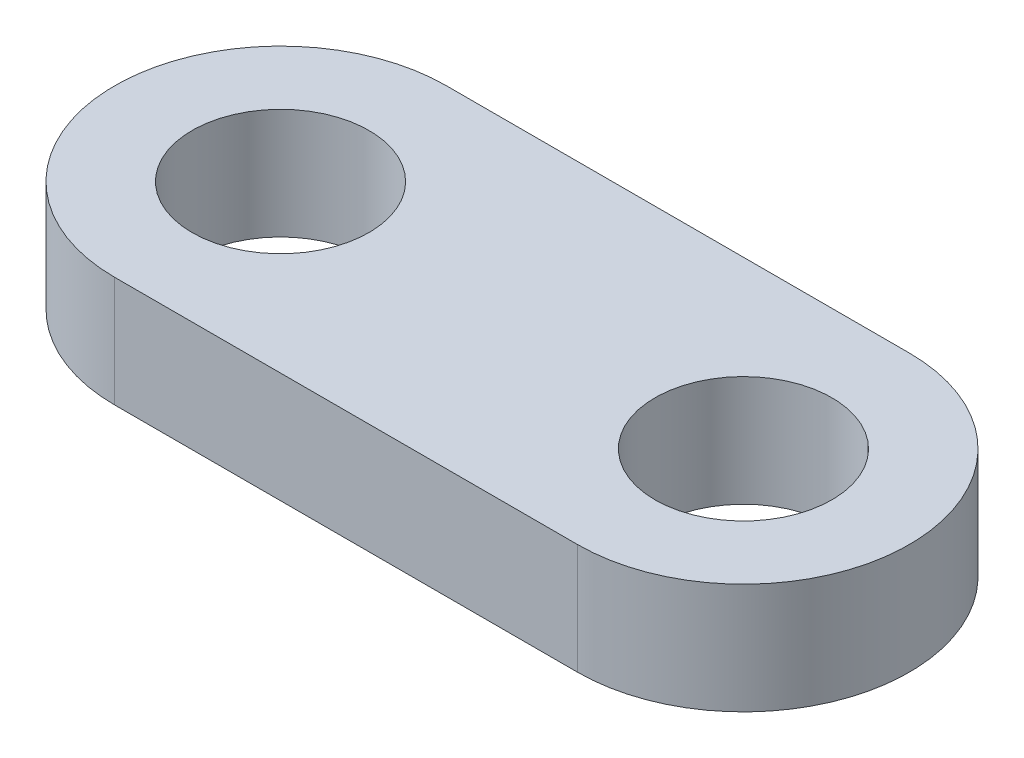
ISO-10303-21;
HEADER;
FILE_DESCRIPTION(('STEP AP214'),'2;1');
FILE_NAME('part.step','',(''),(''),'','','');
FILE_SCHEMA(('AUTOMOTIVE_DESIGN { 1 0 10303 214 1 1 1 1 }'));
ENDSEC;
DATA;
#1=APPLICATION_CONTEXT('core data for automotive mechanical design processes');
#2=APPLICATION_PROTOCOL_DEFINITION('international standard','automotive_design',2000,#1);
#3=PRODUCT_CONTEXT('',#1,'mechanical');
#4=PRODUCT('Part','Part','',(#3));
#5=PRODUCT_RELATED_PRODUCT_CATEGORY('part','',(#4));
#6=PRODUCT_DEFINITION_FORMATION('','',#4);
#7=PRODUCT_DEFINITION_CONTEXT('part definition',#1,'design');
#8=PRODUCT_DEFINITION('design','',#6,#7);
#9=PRODUCT_DEFINITION_SHAPE('','',#8);
#10=(LENGTH_UNIT() NAMED_UNIT(*) SI_UNIT(.MILLI.,.METRE.));
#11=(NAMED_UNIT(*) PLANE_ANGLE_UNIT() SI_UNIT($,.RADIAN.));
#12=(NAMED_UNIT(*) SI_UNIT($,.STERADIAN.) SOLID_ANGLE_UNIT());
#13=UNCERTAINTY_MEASURE_WITH_UNIT(LENGTH_MEASURE(1.E-05),#10,'distance_accuracy_value','');
#14=(GEOMETRIC_REPRESENTATION_CONTEXT(3) GLOBAL_UNCERTAINTY_ASSIGNED_CONTEXT((#13)) GLOBAL_UNIT_ASSIGNED_CONTEXT((#10,
#11,#12)) REPRESENTATION_CONTEXT('',''));
#15=CARTESIAN_POINT('',(0.,0.,0.));
#16=DIRECTION('',(0.,0.,1.));
#17=DIRECTION('',(1.,0.,0.));
#18=AXIS2_PLACEMENT_3D('',#15,#16,#17);
#19=CARTESIAN_POINT('',(3.1395,4.25,0.));
#20=DIRECTION('',(0.,1.,0.));
#21=DIRECTION('',(0.,0.,1.));
#22=AXIS2_PLACEMENT_3D('',#19,#20,#21);
#23=PLANE('',#22);
#24=CARTESIAN_POINT('',(17.7905,4.25,0.));
#25=DIRECTION('',(0.,1.,0.));
#26=DIRECTION('',(0.,0.,1.));
#27=AXIS2_PLACEMENT_3D('',#24,#25,#26);
#28=CIRCLE('',#27,2.8);
#29=CARTESIAN_POINT('',(17.7905,4.25,2.8));
#30=VERTEX_POINT('',#29);
#31=EDGE_CURVE('E101',#30,#30,#28,.T.);
#32=ORIENTED_EDGE('',*,*,#31,.F.);
#33=EDGE_LOOP('',(#32));
#34=FACE_BOUND('',#33,.T.);
#35=CARTESIAN_POINT('',(3.1395,4.25,0.));
#36=DIRECTION('',(0.,1.,0.));
#37=DIRECTION('',(0.,0.,1.));
#38=AXIS2_PLACEMENT_3D('',#35,#36,#37);
#39=CIRCLE('',#38,5.25);
#40=CARTESIAN_POINT('',(3.1395,4.25,-5.25));
#41=VERTEX_POINT('',#40);
#42=CARTESIAN_POINT('',(3.1395,4.25,5.25));
#43=VERTEX_POINT('',#42);
#44=EDGE_CURVE('E86',#41,#43,#39,.T.);
#45=ORIENTED_EDGE('',*,*,#44,.T.);
#46=DIRECTION('',(1.,0.,0.));
#47=VECTOR('',#46,1.);
#48=CARTESIAN_POINT('',(3.1395,4.25,5.25));
#49=LINE('',#48,#47);
#50=CARTESIAN_POINT('',(17.7905,4.25,5.25));
#51=VERTEX_POINT('',#50);
#52=EDGE_CURVE('E81',#43,#51,#49,.T.);
#53=ORIENTED_EDGE('',*,*,#52,.T.);
#54=CARTESIAN_POINT('',(17.7905,4.25,0.));
#55=DIRECTION('',(0.,1.,0.));
#56=DIRECTION('',(0.,0.,1.));
#57=AXIS2_PLACEMENT_3D('',#54,#55,#56);
#58=CIRCLE('',#57,5.25);
#59=CARTESIAN_POINT('',(17.7905,4.25,-5.25));
#60=VERTEX_POINT('',#59);
#61=EDGE_CURVE('E84',#51,#60,#58,.T.);
#62=ORIENTED_EDGE('',*,*,#61,.T.);
#63=DIRECTION('',(-1.,0.,0.));
#64=VECTOR('',#63,1.);
#65=CARTESIAN_POINT('',(3.1395,4.25,-5.25));
#66=LINE('',#65,#64);
#67=EDGE_CURVE('E51',#60,#41,#66,.T.);
#68=ORIENTED_EDGE('',*,*,#67,.T.);
#69=EDGE_LOOP('',(#45,#53,#62,#68));
#70=FACE_BOUND('',#69,.T.);
#71=CARTESIAN_POINT('',(3.1395,4.25,0.));
#72=DIRECTION('',(0.,1.,0.));
#73=DIRECTION('',(0.,0.,1.));
#74=AXIS2_PLACEMENT_3D('',#71,#72,#73);
#75=CIRCLE('',#74,2.8);
#76=CARTESIAN_POINT('',(3.1395,4.25,2.8));
#77=VERTEX_POINT('',#76);
#78=EDGE_CURVE('E116',#77,#77,#75,.T.);
#79=ORIENTED_EDGE('',*,*,#78,.F.);
#80=EDGE_LOOP('',(#79));
#81=FACE_BOUND('',#80,.T.);
#82=ADVANCED_FACE('F34',(#34,#70,#81),#23,.T.);
#83=CARTESIAN_POINT('',(3.1395,0.75,0.));
#84=DIRECTION('',(0.,1.,0.));
#85=DIRECTION('',(0.,0.,1.));
#86=AXIS2_PLACEMENT_3D('',#83,#84,#85);
#87=PLANE('',#86);
#88=CARTESIAN_POINT('',(3.1395,0.75,0.));
#89=DIRECTION('',(0.,1.,0.));
#90=DIRECTION('',(0.,0.,1.));
#91=AXIS2_PLACEMENT_3D('',#88,#89,#90);
#92=CIRCLE('',#91,5.25);
#93=CARTESIAN_POINT('',(3.1395,0.75,-5.25));
#94=VERTEX_POINT('',#93);
#95=CARTESIAN_POINT('',(3.1395,0.75,5.25));
#96=VERTEX_POINT('',#95);
#97=EDGE_CURVE('E98',#94,#96,#92,.T.);
#98=ORIENTED_EDGE('',*,*,#97,.F.);
#99=DIRECTION('',(-1.,0.,0.));
#100=VECTOR('',#99,1.);
#101=CARTESIAN_POINT('',(3.1395,0.75,-5.25));
#102=LINE('',#101,#100);
#103=CARTESIAN_POINT('',(17.7905,0.75,-5.25));
#104=VERTEX_POINT('',#103);
#105=EDGE_CURVE('E74',#104,#94,#102,.T.);
#106=ORIENTED_EDGE('',*,*,#105,.F.);
#107=CARTESIAN_POINT('',(17.7905,0.75,0.));
#108=DIRECTION('',(0.,1.,0.));
#109=DIRECTION('',(0.,0.,1.));
#110=AXIS2_PLACEMENT_3D('',#107,#108,#109);
#111=CIRCLE('',#110,5.25);
#112=CARTESIAN_POINT('',(17.7905,0.75,5.25));
#113=VERTEX_POINT('',#112);
#114=EDGE_CURVE('E68',#113,#104,#111,.T.);
#115=ORIENTED_EDGE('',*,*,#114,.F.);
#116=DIRECTION('',(1.,0.,0.));
#117=VECTOR('',#116,1.);
#118=CARTESIAN_POINT('',(3.1395,0.75,5.25));
#119=LINE('',#118,#117);
#120=EDGE_CURVE('E90',#96,#113,#119,.T.);
#121=ORIENTED_EDGE('',*,*,#120,.F.);
#122=EDGE_LOOP('',(#98,#106,#115,#121));
#123=FACE_BOUND('',#122,.T.);
#124=CARTESIAN_POINT('',(17.7905,0.75,0.));
#125=DIRECTION('',(0.,1.,0.));
#126=DIRECTION('',(0.,0.,1.));
#127=AXIS2_PLACEMENT_3D('',#124,#125,#126);
#128=CIRCLE('',#127,2.8);
#129=CARTESIAN_POINT('',(17.7905,0.75,2.8));
#130=VERTEX_POINT('',#129);
#131=EDGE_CURVE('E113',#130,#130,#128,.T.);
#132=ORIENTED_EDGE('',*,*,#131,.T.);
#133=EDGE_LOOP('',(#132));
#134=FACE_BOUND('',#133,.T.);
#135=CARTESIAN_POINT('',(3.1395,0.75,0.));
#136=DIRECTION('',(0.,1.,0.));
#137=DIRECTION('',(0.,0.,1.));
#138=AXIS2_PLACEMENT_3D('',#135,#136,#137);
#139=CIRCLE('',#138,2.8);
#140=CARTESIAN_POINT('',(3.1395,0.75,2.8));
#141=VERTEX_POINT('',#140);
#142=EDGE_CURVE('E119',#141,#141,#139,.T.);
#143=ORIENTED_EDGE('',*,*,#142,.T.);
#144=EDGE_LOOP('',(#143));
#145=FACE_BOUND('',#144,.T.);
#146=ADVANCED_FACE('F109',(#123,#134,#145),#87,.F.);
#147=CARTESIAN_POINT('',(3.1395,4.25,0.));
#148=DIRECTION('',(0.,-1.,0.));
#149=DIRECTION('',(0.,0.,-1.));
#150=AXIS2_PLACEMENT_3D('',#147,#148,#149);
#151=CYLINDRICAL_SURFACE('',#150,5.25);
#152=ORIENTED_EDGE('',*,*,#97,.T.);
#153=DIRECTION('',(0.,-1.,0.));
#154=VECTOR('',#153,1.);
#155=CARTESIAN_POINT('',(3.1395,4.25,5.25));
#156=LINE('',#155,#154);
#157=EDGE_CURVE('E11',#43,#96,#156,.T.);
#158=ORIENTED_EDGE('',*,*,#157,.F.);
#159=ORIENTED_EDGE('',*,*,#44,.F.);
#160=DIRECTION('',(0.,-1.,0.));
#161=VECTOR('',#160,1.);
#162=CARTESIAN_POINT('',(3.1395,4.25,-5.25));
#163=LINE('',#162,#161);
#164=EDGE_CURVE('E94',#41,#94,#163,.T.);
#165=ORIENTED_EDGE('',*,*,#164,.T.);
#166=EDGE_LOOP('',(#152,#158,#159,#165));
#167=FACE_BOUND('',#166,.T.);
#168=ADVANCED_FACE('F36',(#167),#151,.T.);
#169=CARTESIAN_POINT('',(3.1395,4.25,5.25));
#170=DIRECTION('',(0.,0.,-1.));
#171=DIRECTION('',(-1.,0.,0.));
#172=AXIS2_PLACEMENT_3D('',#169,#170,#171);
#173=PLANE('',#172);
#174=ORIENTED_EDGE('',*,*,#120,.T.);
#175=DIRECTION('',(0.,-1.,0.));
#176=VECTOR('',#175,1.);
#177=CARTESIAN_POINT('',(17.7905,4.25,5.25));
#178=LINE('',#177,#176);
#179=EDGE_CURVE('E43',#51,#113,#178,.T.);
#180=ORIENTED_EDGE('',*,*,#179,.F.);
#181=ORIENTED_EDGE('',*,*,#52,.F.);
#182=ORIENTED_EDGE('',*,*,#157,.T.);
#183=EDGE_LOOP('',(#174,#180,#181,#182));
#184=FACE_BOUND('',#183,.T.);
#185=ADVANCED_FACE('F89',(#184),#173,.F.);
#186=CARTESIAN_POINT('',(17.7905,4.25,0.));
#187=DIRECTION('',(0.,-1.,0.));
#188=DIRECTION('',(0.,0.,-1.));
#189=AXIS2_PLACEMENT_3D('',#186,#187,#188);
#190=CYLINDRICAL_SURFACE('',#189,5.25);
#191=ORIENTED_EDGE('',*,*,#114,.T.);
#192=DIRECTION('',(0.,-1.,0.));
#193=VECTOR('',#192,1.);
#194=CARTESIAN_POINT('',(17.7905,4.25,-5.25));
#195=LINE('',#194,#193);
#196=EDGE_CURVE('E91',#60,#104,#195,.T.);
#197=ORIENTED_EDGE('',*,*,#196,.F.);
#198=ORIENTED_EDGE('',*,*,#61,.F.);
#199=ORIENTED_EDGE('',*,*,#179,.T.);
#200=EDGE_LOOP('',(#191,#197,#198,#199));
#201=FACE_BOUND('',#200,.T.);
#202=ADVANCED_FACE('F92',(#201),#190,.T.);
#203=CARTESIAN_POINT('',(3.1395,4.25,-5.25));
#204=DIRECTION('',(0.,0.,1.));
#205=DIRECTION('',(1.,0.,0.));
#206=AXIS2_PLACEMENT_3D('',#203,#204,#205);
#207=PLANE('',#206);
#208=ORIENTED_EDGE('',*,*,#105,.T.);
#209=ORIENTED_EDGE('',*,*,#164,.F.);
#210=ORIENTED_EDGE('',*,*,#67,.F.);
#211=ORIENTED_EDGE('',*,*,#196,.T.);
#212=EDGE_LOOP('',(#208,#209,#210,#211));
#213=FACE_BOUND('',#212,.T.);
#214=ADVANCED_FACE('F106',(#213),#207,.F.);
#215=CARTESIAN_POINT('',(17.7905,4.25,0.));
#216=DIRECTION('',(0.,-1.,0.));
#217=DIRECTION('',(0.,0.,-1.));
#218=AXIS2_PLACEMENT_3D('',#215,#216,#217);
#219=CYLINDRICAL_SURFACE('',#218,2.8);
#220=ORIENTED_EDGE('',*,*,#31,.T.);
#221=EDGE_LOOP('',(#220));
#222=FACE_BOUND('',#221,.T.);
#223=ORIENTED_EDGE('',*,*,#131,.F.);
#224=EDGE_LOOP('',(#223));
#225=FACE_BOUND('',#224,.T.);
#226=ADVANCED_FACE('F136',(#222,#225),#219,.F.);
#227=CARTESIAN_POINT('',(3.1395,4.25,0.));
#228=DIRECTION('',(0.,-1.,0.));
#229=DIRECTION('',(0.,0.,-1.));
#230=AXIS2_PLACEMENT_3D('',#227,#228,#229);
#231=CYLINDRICAL_SURFACE('',#230,2.8);
#232=ORIENTED_EDGE('',*,*,#78,.T.);
#233=EDGE_LOOP('',(#232));
#234=FACE_BOUND('',#233,.T.);
#235=ORIENTED_EDGE('',*,*,#142,.F.);
#236=EDGE_LOOP('',(#235));
#237=FACE_BOUND('',#236,.T.);
#238=ADVANCED_FACE('F125',(#234,#237),#231,.F.);
#239=CLOSED_SHELL('',(#82,#146,#168,#185,#202,#214,#226,#238));
#240=MANIFOLD_SOLID_BREP('B2',#239);
#241=ADVANCED_BREP_SHAPE_REPRESENTATION('',(#18,#240),#14);
#242=SHAPE_DEFINITION_REPRESENTATION(#9,#241);
ENDSEC;
END-ISO-10303-21;
